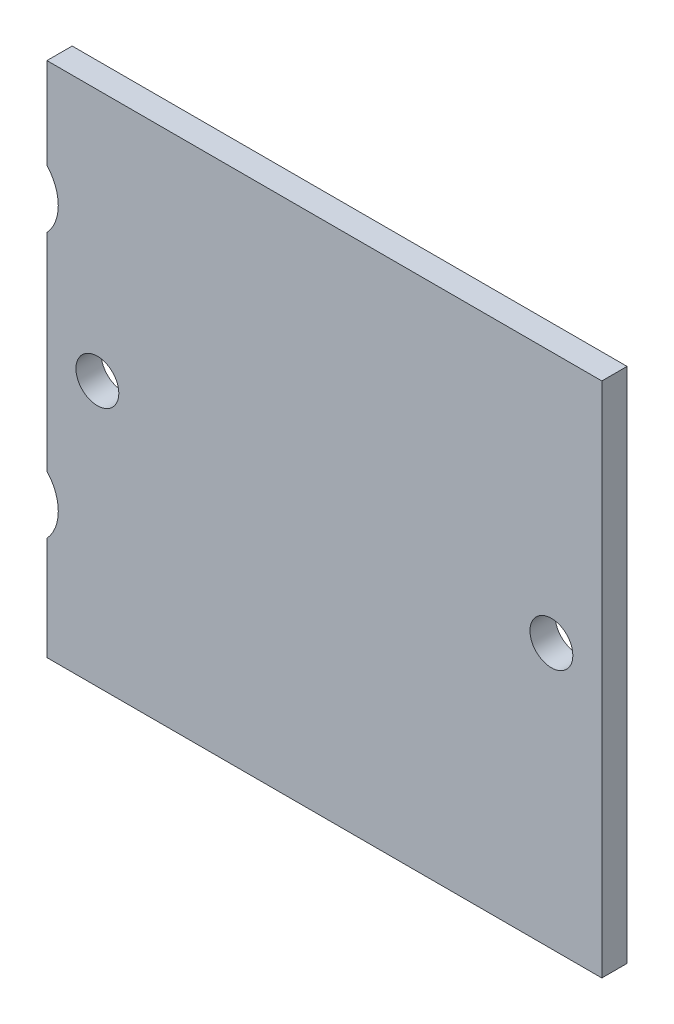
ISO-10303-21;
HEADER;
FILE_DESCRIPTION(('STEP AP214'),'2;1');
FILE_NAME('part.step','',(''),(''),'','','');
FILE_SCHEMA(('AUTOMOTIVE_DESIGN { 1 0 10303 214 1 1 1 1 }'));
ENDSEC;
DATA;
#1=APPLICATION_CONTEXT('core data for automotive mechanical design processes');
#2=APPLICATION_PROTOCOL_DEFINITION('international standard','automotive_design',2000,#1);
#3=PRODUCT_CONTEXT('',#1,'mechanical');
#4=PRODUCT('Part','Part','',(#3));
#5=PRODUCT_RELATED_PRODUCT_CATEGORY('part','',(#4));
#6=PRODUCT_DEFINITION_FORMATION('','',#4);
#7=PRODUCT_DEFINITION_CONTEXT('part definition',#1,'design');
#8=PRODUCT_DEFINITION('design','',#6,#7);
#9=PRODUCT_DEFINITION_SHAPE('','',#8);
#10=(LENGTH_UNIT() NAMED_UNIT(*) SI_UNIT(.MILLI.,.METRE.));
#11=(NAMED_UNIT(*) PLANE_ANGLE_UNIT() SI_UNIT($,.RADIAN.));
#12=(NAMED_UNIT(*) SI_UNIT($,.STERADIAN.) SOLID_ANGLE_UNIT());
#13=UNCERTAINTY_MEASURE_WITH_UNIT(LENGTH_MEASURE(1.E-05),#10,'distance_accuracy_value','');
#14=(GEOMETRIC_REPRESENTATION_CONTEXT(3) GLOBAL_UNCERTAINTY_ASSIGNED_CONTEXT((#13)) GLOBAL_UNIT_ASSIGNED_CONTEXT((#10,
#11,#12)) REPRESENTATION_CONTEXT('',''));
#15=CARTESIAN_POINT('',(0.,0.,0.));
#16=DIRECTION('',(0.,0.,1.));
#17=DIRECTION('',(1.,0.,0.));
#18=AXIS2_PLACEMENT_3D('',#15,#16,#17);
#19=CARTESIAN_POINT('',(175.499999999999,-10.5000000000003,48.5));
#20=DIRECTION('',(0.,0.,1.));
#21=DIRECTION('',(1.,0.,0.));
#22=AXIS2_PLACEMENT_3D('',#19,#20,#21);
#23=CYLINDRICAL_SURFACE('',#22,3.4000000000005);
#24=CARTESIAN_POINT('',(175.499999999999,-10.5000000000003,50.5));
#25=DIRECTION('',(0.,0.,-1.));
#26=DIRECTION('',(1.,0.,0.));
#27=AXIS2_PLACEMENT_3D('',#24,#25,#26);
#28=CIRCLE('',#27,3.4000000000005);
#29=CARTESIAN_POINT('',(178.,-8.19565627563971,50.5));
#30=VERTEX_POINT('',#29);
#31=CARTESIAN_POINT('',(178.,-12.8043437243606,50.5));
#32=VERTEX_POINT('',#31);
#33=EDGE_CURVE('E139',#30,#32,#28,.T.);
#34=ORIENTED_EDGE('',*,*,#33,.F.);
#35=DIRECTION('',(0.,0.,1.));
#36=VECTOR('',#35,1.);
#37=CARTESIAN_POINT('',(178.,-8.19565627563971,48.5));
#38=LINE('',#37,#36);
#39=CARTESIAN_POINT('',(178.,-8.19565627563971,48.5));
#40=VERTEX_POINT('',#39);
#41=EDGE_CURVE('E11',#40,#30,#38,.T.);
#42=ORIENTED_EDGE('',*,*,#41,.F.);
#43=CARTESIAN_POINT('',(175.499999999999,-10.5000000000003,48.5));
#44=DIRECTION('',(0.,0.,-1.));
#45=DIRECTION('',(1.,0.,0.));
#46=AXIS2_PLACEMENT_3D('',#43,#44,#45);
#47=CIRCLE('',#46,3.4000000000005);
#48=CARTESIAN_POINT('',(178.,-12.8043437243606,48.5));
#49=VERTEX_POINT('',#48);
#50=EDGE_CURVE('E157',#40,#49,#47,.T.);
#51=ORIENTED_EDGE('',*,*,#50,.T.);
#52=DIRECTION('',(0.,0.,1.));
#53=VECTOR('',#52,1.);
#54=CARTESIAN_POINT('',(178.,-12.8043437243606,48.5));
#55=LINE('',#54,#53);
#56=EDGE_CURVE('E42',#49,#32,#55,.T.);
#57=ORIENTED_EDGE('',*,*,#56,.T.);
#58=EDGE_LOOP('',(#34,#42,#51,#57));
#59=FACE_BOUND('',#58,.T.);
#60=ADVANCED_FACE('F41',(#59),#23,.F.);
#61=CARTESIAN_POINT('',(178.,8.1956562756399,48.5));
#62=DIRECTION('',(-1.,0.,0.));
#63=DIRECTION('',(0.,-1.,0.));
#64=AXIS2_PLACEMENT_3D('',#61,#62,#63);
#65=PLANE('',#64);
#66=DIRECTION('',(0.,-1.,0.));
#67=VECTOR('',#66,1.);
#68=CARTESIAN_POINT('',(178.,8.1956562756399,50.5));
#69=LINE('',#68,#67);
#70=CARTESIAN_POINT('',(178.,8.19565627563978,50.5));
#71=VERTEX_POINT('',#70);
#72=EDGE_CURVE('E160',#71,#30,#69,.T.);
#73=ORIENTED_EDGE('',*,*,#72,.F.);
#74=DIRECTION('',(0.,0.,1.));
#75=VECTOR('',#74,1.);
#76=CARTESIAN_POINT('',(178.,8.19565627563978,48.5));
#77=LINE('',#76,#75);
#78=CARTESIAN_POINT('',(178.,8.19565627563978,48.5));
#79=VERTEX_POINT('',#78);
#80=EDGE_CURVE('E49',#79,#71,#77,.T.);
#81=ORIENTED_EDGE('',*,*,#80,.F.);
#82=DIRECTION('',(0.,-1.,0.));
#83=VECTOR('',#82,1.);
#84=CARTESIAN_POINT('',(178.,8.1956562756399,48.5));
#85=LINE('',#84,#83);
#86=EDGE_CURVE('E126',#79,#40,#85,.T.);
#87=ORIENTED_EDGE('',*,*,#86,.T.);
#88=ORIENTED_EDGE('',*,*,#41,.T.);
#89=EDGE_LOOP('',(#73,#81,#87,#88));
#90=FACE_BOUND('',#89,.T.);
#91=ADVANCED_FACE('F172',(#90),#65,.T.);
#92=CARTESIAN_POINT('',(175.500000000001,10.5000000000003,48.5));
#93=DIRECTION('',(0.,0.,1.));
#94=DIRECTION('',(1.,0.,0.));
#95=AXIS2_PLACEMENT_3D('',#92,#93,#94);
#96=CYLINDRICAL_SURFACE('',#95,3.39999999999951);
#97=CARTESIAN_POINT('',(175.500000000001,10.5000000000003,50.5));
#98=DIRECTION('',(0.,0.,-1.));
#99=DIRECTION('',(1.,0.,0.));
#100=AXIS2_PLACEMENT_3D('',#97,#98,#99);
#101=CIRCLE('',#100,3.39999999999951);
#102=CARTESIAN_POINT('',(178.,12.8043437243609,50.5));
#103=VERTEX_POINT('',#102);
#104=EDGE_CURVE('E113',#103,#71,#101,.T.);
#105=ORIENTED_EDGE('',*,*,#104,.F.);
#106=DIRECTION('',(0.,0.,1.));
#107=VECTOR('',#106,1.);
#108=CARTESIAN_POINT('',(178.,12.8043437243609,48.5));
#109=LINE('',#108,#107);
#110=CARTESIAN_POINT('',(178.,12.8043437243609,48.5));
#111=VERTEX_POINT('',#110);
#112=EDGE_CURVE('E109',#111,#103,#109,.T.);
#113=ORIENTED_EDGE('',*,*,#112,.F.);
#114=CARTESIAN_POINT('',(175.500000000001,10.5000000000003,48.5));
#115=DIRECTION('',(0.,0.,-1.));
#116=DIRECTION('',(1.,0.,0.));
#117=AXIS2_PLACEMENT_3D('',#114,#115,#116);
#118=CIRCLE('',#117,3.39999999999951);
#119=EDGE_CURVE('E114',#111,#79,#118,.T.);
#120=ORIENTED_EDGE('',*,*,#119,.T.);
#121=ORIENTED_EDGE('',*,*,#80,.T.);
#122=EDGE_LOOP('',(#105,#113,#120,#121));
#123=FACE_BOUND('',#122,.T.);
#124=ADVANCED_FACE('F115',(#123),#96,.F.);
#125=CARTESIAN_POINT('',(178.,20.,48.5));
#126=DIRECTION('',(-1.,0.,0.));
#127=DIRECTION('',(0.,-1.,0.));
#128=AXIS2_PLACEMENT_3D('',#125,#126,#127);
#129=PLANE('',#128);
#130=DIRECTION('',(0.,-1.,0.));
#131=VECTOR('',#130,1.);
#132=CARTESIAN_POINT('',(178.,20.,50.5));
#133=LINE('',#132,#131);
#134=CARTESIAN_POINT('',(178.,20.,50.5));
#135=VERTEX_POINT('',#134);
#136=EDGE_CURVE('E152',#135,#103,#133,.T.);
#137=ORIENTED_EDGE('',*,*,#136,.F.);
#138=DIRECTION('',(0.,0.,1.));
#139=VECTOR('',#138,1.);
#140=CARTESIAN_POINT('',(178.,20.,48.5));
#141=LINE('',#140,#139);
#142=CARTESIAN_POINT('',(178.,20.,48.5));
#143=VERTEX_POINT('',#142);
#144=EDGE_CURVE('E118',#143,#135,#141,.T.);
#145=ORIENTED_EDGE('',*,*,#144,.F.);
#146=DIRECTION('',(0.,-1.,0.));
#147=VECTOR('',#146,1.);
#148=CARTESIAN_POINT('',(178.,20.,48.5));
#149=LINE('',#148,#147);
#150=EDGE_CURVE('E127',#143,#111,#149,.T.);
#151=ORIENTED_EDGE('',*,*,#150,.T.);
#152=ORIENTED_EDGE('',*,*,#112,.T.);
#153=EDGE_LOOP('',(#137,#145,#151,#152));
#154=FACE_BOUND('',#153,.T.);
#155=ADVANCED_FACE('F128',(#154),#129,.T.);
#156=CARTESIAN_POINT('',(178.,20.,48.5));
#157=DIRECTION('',(0.,1.,0.));
#158=DIRECTION('',(-1.,0.,0.));
#159=AXIS2_PLACEMENT_3D('',#156,#157,#158);
#160=PLANE('',#159);
#161=DIRECTION('',(-1.,0.,0.));
#162=VECTOR('',#161,1.);
#163=CARTESIAN_POINT('',(178.,20.,50.5));
#164=LINE('',#163,#162);
#165=CARTESIAN_POINT('',(222.,20.,50.5));
#166=VERTEX_POINT('',#165);
#167=EDGE_CURVE('E151',#166,#135,#164,.T.);
#168=ORIENTED_EDGE('',*,*,#167,.F.);
#169=DIRECTION('',(0.,0.,1.));
#170=VECTOR('',#169,1.);
#171=CARTESIAN_POINT('',(222.,20.,48.5));
#172=LINE('',#171,#170);
#173=CARTESIAN_POINT('',(222.,20.,48.5));
#174=VERTEX_POINT('',#173);
#175=EDGE_CURVE('E162',#174,#166,#172,.T.);
#176=ORIENTED_EDGE('',*,*,#175,.F.);
#177=DIRECTION('',(-1.,0.,0.));
#178=VECTOR('',#177,1.);
#179=CARTESIAN_POINT('',(178.,20.,48.5));
#180=LINE('',#179,#178);
#181=EDGE_CURVE('E132',#174,#143,#180,.T.);
#182=ORIENTED_EDGE('',*,*,#181,.T.);
#183=ORIENTED_EDGE('',*,*,#144,.T.);
#184=EDGE_LOOP('',(#168,#176,#182,#183));
#185=FACE_BOUND('',#184,.T.);
#186=ADVANCED_FACE('F184',(#185),#160,.T.);
#187=CARTESIAN_POINT('',(222.,20.,48.5));
#188=DIRECTION('',(1.,0.,0.));
#189=DIRECTION('',(0.,0.,-1.));
#190=AXIS2_PLACEMENT_3D('',#187,#188,#189);
#191=PLANE('',#190);
#192=DIRECTION('',(0.,1.,0.));
#193=VECTOR('',#192,1.);
#194=CARTESIAN_POINT('',(222.,20.,50.5));
#195=LINE('',#194,#193);
#196=CARTESIAN_POINT('',(222.,-21.,50.5));
#197=VERTEX_POINT('',#196);
#198=EDGE_CURVE('E146',#197,#166,#195,.T.);
#199=ORIENTED_EDGE('',*,*,#198,.F.);
#200=DIRECTION('',(0.,0.,1.));
#201=VECTOR('',#200,1.);
#202=CARTESIAN_POINT('',(222.,-21.,48.5));
#203=LINE('',#202,#201);
#204=CARTESIAN_POINT('',(222.,-21.,48.5));
#205=VERTEX_POINT('',#204);
#206=EDGE_CURVE('E164',#205,#197,#203,.T.);
#207=ORIENTED_EDGE('',*,*,#206,.F.);
#208=DIRECTION('',(0.,1.,0.));
#209=VECTOR('',#208,1.);
#210=CARTESIAN_POINT('',(222.,20.,48.5));
#211=LINE('',#210,#209);
#212=EDGE_CURVE('E134',#205,#174,#211,.T.);
#213=ORIENTED_EDGE('',*,*,#212,.T.);
#214=ORIENTED_EDGE('',*,*,#175,.T.);
#215=EDGE_LOOP('',(#199,#207,#213,#214));
#216=FACE_BOUND('',#215,.T.);
#217=ADVANCED_FACE('F190',(#216),#191,.T.);
#218=CARTESIAN_POINT('',(178.,-21.,48.5));
#219=DIRECTION('',(0.,-1.,0.));
#220=DIRECTION('',(0.,0.,-1.));
#221=AXIS2_PLACEMENT_3D('',#218,#219,#220);
#222=PLANE('',#221);
#223=DIRECTION('',(1.,0.,0.));
#224=VECTOR('',#223,1.);
#225=CARTESIAN_POINT('',(178.,-21.,50.5));
#226=LINE('',#225,#224);
#227=CARTESIAN_POINT('',(178.,-21.,50.5));
#228=VERTEX_POINT('',#227);
#229=EDGE_CURVE('E144',#228,#197,#226,.T.);
#230=ORIENTED_EDGE('',*,*,#229,.F.);
#231=DIRECTION('',(0.,0.,1.));
#232=VECTOR('',#231,1.);
#233=CARTESIAN_POINT('',(178.,-21.,48.5));
#234=LINE('',#233,#232);
#235=CARTESIAN_POINT('',(178.,-21.,48.5));
#236=VERTEX_POINT('',#235);
#237=EDGE_CURVE('E167',#236,#228,#234,.T.);
#238=ORIENTED_EDGE('',*,*,#237,.F.);
#239=DIRECTION('',(1.,0.,0.));
#240=VECTOR('',#239,1.);
#241=CARTESIAN_POINT('',(178.,-21.,48.5));
#242=LINE('',#241,#240);
#243=EDGE_CURVE('E234',#236,#205,#242,.T.);
#244=ORIENTED_EDGE('',*,*,#243,.T.);
#245=ORIENTED_EDGE('',*,*,#206,.T.);
#246=EDGE_LOOP('',(#230,#238,#244,#245));
#247=FACE_BOUND('',#246,.T.);
#248=ADVANCED_FACE('F192',(#247),#222,.T.);
#249=CARTESIAN_POINT('',(178.,-12.8043437243606,48.5));
#250=DIRECTION('',(-1.,0.,0.));
#251=DIRECTION('',(0.,0.,1.));
#252=AXIS2_PLACEMENT_3D('',#249,#250,#251);
#253=PLANE('',#252);
#254=DIRECTION('',(0.,-1.,0.));
#255=VECTOR('',#254,1.);
#256=CARTESIAN_POINT('',(178.,-12.8043437243606,50.5));
#257=LINE('',#256,#255);
#258=EDGE_CURVE('E143',#32,#228,#257,.T.);
#259=ORIENTED_EDGE('',*,*,#258,.F.);
#260=ORIENTED_EDGE('',*,*,#56,.F.);
#261=DIRECTION('',(0.,-1.,0.));
#262=VECTOR('',#261,1.);
#263=CARTESIAN_POINT('',(178.,-12.8043437243606,48.5));
#264=LINE('',#263,#262);
#265=EDGE_CURVE('E232',#49,#236,#264,.T.);
#266=ORIENTED_EDGE('',*,*,#265,.T.);
#267=ORIENTED_EDGE('',*,*,#237,.T.);
#268=EDGE_LOOP('',(#259,#260,#266,#267));
#269=FACE_BOUND('',#268,.T.);
#270=ADVANCED_FACE('F169',(#269),#253,.T.);
#271=CARTESIAN_POINT('',(175.499999999999,-10.5000000000003,48.5));
#272=DIRECTION('',(0.,0.,1.));
#273=DIRECTION('',(1.,0.,0.));
#274=AXIS2_PLACEMENT_3D('',#271,#272,#273);
#275=PLANE('',#274);
#276=CARTESIAN_POINT('',(218.,0.,48.5));
#277=DIRECTION('',(0.,0.,1.));
#278=DIRECTION('',(1.,0.,0.));
#279=AXIS2_PLACEMENT_3D('',#276,#277,#278);
#280=CIRCLE('',#279,1.70000000000001);
#281=CARTESIAN_POINT('',(219.7,0.,48.5));
#282=VERTEX_POINT('',#281);
#283=EDGE_CURVE('E217',#282,#282,#280,.T.);
#284=ORIENTED_EDGE('',*,*,#283,.T.);
#285=EDGE_LOOP('',(#284));
#286=FACE_BOUND('',#285,.T.);
#287=CARTESIAN_POINT('',(182.,0.,48.5));
#288=DIRECTION('',(0.,0.,1.));
#289=DIRECTION('',(1.,0.,0.));
#290=AXIS2_PLACEMENT_3D('',#287,#288,#289);
#291=CIRCLE('',#290,1.70000000000001);
#292=CARTESIAN_POINT('',(183.7,0.,48.5));
#293=VERTEX_POINT('',#292);
#294=EDGE_CURVE('E142',#293,#293,#291,.T.);
#295=ORIENTED_EDGE('',*,*,#294,.T.);
#296=EDGE_LOOP('',(#295));
#297=FACE_BOUND('',#296,.T.);
#298=ORIENTED_EDGE('',*,*,#50,.F.);
#299=ORIENTED_EDGE('',*,*,#86,.F.);
#300=ORIENTED_EDGE('',*,*,#119,.F.);
#301=ORIENTED_EDGE('',*,*,#150,.F.);
#302=ORIENTED_EDGE('',*,*,#181,.F.);
#303=ORIENTED_EDGE('',*,*,#212,.F.);
#304=ORIENTED_EDGE('',*,*,#243,.F.);
#305=ORIENTED_EDGE('',*,*,#265,.F.);
#306=EDGE_LOOP('',(#298,#299,#300,#301,#302,#303,#304,#305));
#307=FACE_BOUND('',#306,.T.);
#308=ADVANCED_FACE('F121',(#286,#297,#307),#275,.F.);
#309=CARTESIAN_POINT('',(175.499999999999,-10.5000000000003,50.5));
#310=DIRECTION('',(0.,0.,1.));
#311=DIRECTION('',(1.,0.,0.));
#312=AXIS2_PLACEMENT_3D('',#309,#310,#311);
#313=PLANE('',#312);
#314=CARTESIAN_POINT('',(218.,0.,50.5));
#315=DIRECTION('',(0.,0.,1.));
#316=DIRECTION('',(1.,0.,0.));
#317=AXIS2_PLACEMENT_3D('',#314,#315,#316);
#318=CIRCLE('',#317,1.70000000000001);
#319=CARTESIAN_POINT('',(219.7,0.,50.5));
#320=VERTEX_POINT('',#319);
#321=EDGE_CURVE('E222',#320,#320,#318,.T.);
#322=ORIENTED_EDGE('',*,*,#321,.F.);
#323=EDGE_LOOP('',(#322));
#324=FACE_BOUND('',#323,.T.);
#325=CARTESIAN_POINT('',(182.,0.,50.5));
#326=DIRECTION('',(0.,0.,1.));
#327=DIRECTION('',(1.,0.,0.));
#328=AXIS2_PLACEMENT_3D('',#325,#326,#327);
#329=CIRCLE('',#328,1.70000000000001);
#330=CARTESIAN_POINT('',(183.7,0.,50.5));
#331=VERTEX_POINT('',#330);
#332=EDGE_CURVE('E224',#331,#331,#329,.T.);
#333=ORIENTED_EDGE('',*,*,#332,.F.);
#334=EDGE_LOOP('',(#333));
#335=FACE_BOUND('',#334,.T.);
#336=ORIENTED_EDGE('',*,*,#33,.T.);
#337=ORIENTED_EDGE('',*,*,#258,.T.);
#338=ORIENTED_EDGE('',*,*,#229,.T.);
#339=ORIENTED_EDGE('',*,*,#198,.T.);
#340=ORIENTED_EDGE('',*,*,#167,.T.);
#341=ORIENTED_EDGE('',*,*,#136,.T.);
#342=ORIENTED_EDGE('',*,*,#104,.T.);
#343=ORIENTED_EDGE('',*,*,#72,.T.);
#344=EDGE_LOOP('',(#336,#337,#338,#339,#340,#341,#342,#343));
#345=FACE_BOUND('',#344,.T.);
#346=ADVANCED_FACE('F168',(#324,#335,#345),#313,.T.);
#347=CARTESIAN_POINT('',(182.,0.,48.5));
#348=DIRECTION('',(0.,0.,1.));
#349=DIRECTION('',(1.,0.,0.));
#350=AXIS2_PLACEMENT_3D('',#347,#348,#349);
#351=CYLINDRICAL_SURFACE('',#350,1.70000000000001);
#352=ORIENTED_EDGE('',*,*,#294,.F.);
#353=EDGE_LOOP('',(#352));
#354=FACE_BOUND('',#353,.T.);
#355=ORIENTED_EDGE('',*,*,#332,.T.);
#356=EDGE_LOOP('',(#355));
#357=FACE_BOUND('',#356,.T.);
#358=ADVANCED_FACE('F201',(#354,#357),#351,.F.);
#359=CARTESIAN_POINT('',(218.,0.,48.5));
#360=DIRECTION('',(0.,0.,1.));
#361=DIRECTION('',(1.,0.,0.));
#362=AXIS2_PLACEMENT_3D('',#359,#360,#361);
#363=CYLINDRICAL_SURFACE('',#362,1.70000000000001);
#364=ORIENTED_EDGE('',*,*,#283,.F.);
#365=EDGE_LOOP('',(#364));
#366=FACE_BOUND('',#365,.T.);
#367=ORIENTED_EDGE('',*,*,#321,.T.);
#368=EDGE_LOOP('',(#367));
#369=FACE_BOUND('',#368,.T.);
#370=ADVANCED_FACE('F209',(#366,#369),#363,.F.);
#371=CLOSED_SHELL('',(#60,#91,#124,#155,#186,#217,#248,#270,#308,#346,#358,#370));
#372=MANIFOLD_SOLID_BREP('B2',#371);
#373=ADVANCED_BREP_SHAPE_REPRESENTATION('',(#18,#372),#14);
#374=SHAPE_DEFINITION_REPRESENTATION(#9,#373);
ENDSEC;
END-ISO-10303-21;
